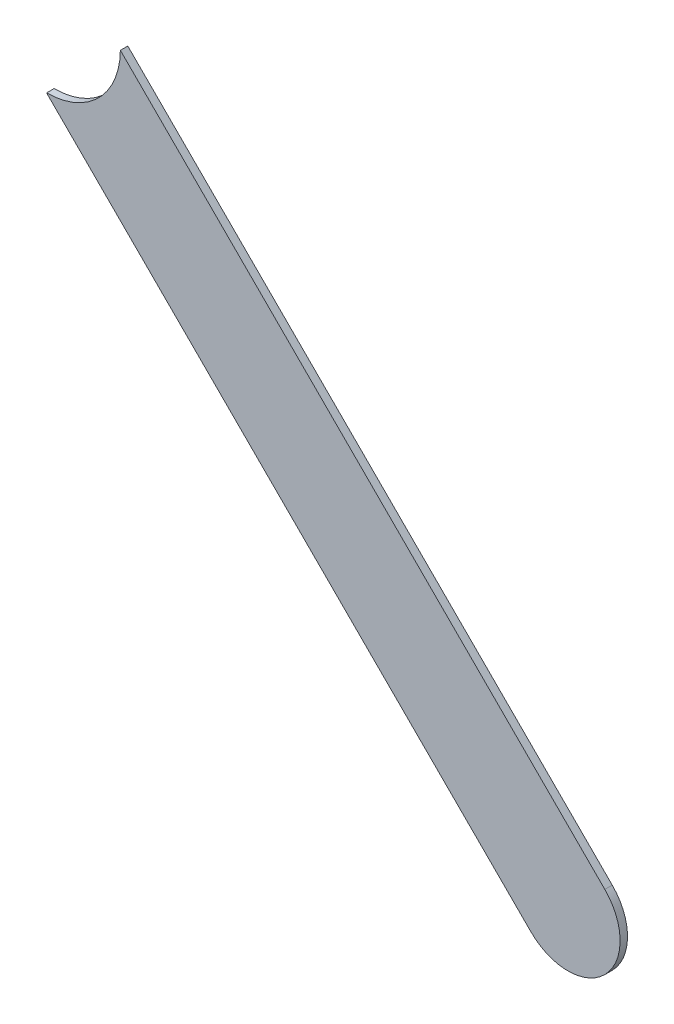
ISO-10303-21;
HEADER;
FILE_DESCRIPTION(('STEP AP214'),'2;1');
FILE_NAME('part.step','',(''),(''),'','','');
FILE_SCHEMA(('AUTOMOTIVE_DESIGN { 1 0 10303 214 1 1 1 1 }'));
ENDSEC;
DATA;
#1=APPLICATION_CONTEXT('core data for automotive mechanical design processes');
#2=APPLICATION_PROTOCOL_DEFINITION('international standard','automotive_design',2000,#1);
#3=PRODUCT_CONTEXT('',#1,'mechanical');
#4=PRODUCT('Part','Part','',(#3));
#5=PRODUCT_RELATED_PRODUCT_CATEGORY('part','',(#4));
#6=PRODUCT_DEFINITION_FORMATION('','',#4);
#7=PRODUCT_DEFINITION_CONTEXT('part definition',#1,'design');
#8=PRODUCT_DEFINITION('design','',#6,#7);
#9=PRODUCT_DEFINITION_SHAPE('','',#8);
#10=(LENGTH_UNIT() NAMED_UNIT(*) SI_UNIT(.MILLI.,.METRE.));
#11=(NAMED_UNIT(*) PLANE_ANGLE_UNIT() SI_UNIT($,.RADIAN.));
#12=(NAMED_UNIT(*) SI_UNIT($,.STERADIAN.) SOLID_ANGLE_UNIT());
#13=UNCERTAINTY_MEASURE_WITH_UNIT(LENGTH_MEASURE(1.E-05),#10,'distance_accuracy_value','');
#14=(GEOMETRIC_REPRESENTATION_CONTEXT(3) GLOBAL_UNCERTAINTY_ASSIGNED_CONTEXT((#13)) GLOBAL_UNIT_ASSIGNED_CONTEXT((#10,
#11,#12)) REPRESENTATION_CONTEXT('',''));
#15=CARTESIAN_POINT('',(0.,0.,0.));
#16=DIRECTION('',(0.,0.,1.));
#17=DIRECTION('',(1.,0.,0.));
#18=AXIS2_PLACEMENT_3D('',#15,#16,#17);
#19=CARTESIAN_POINT('',(62.4020435660036,104.144405153996,0.));
#20=DIRECTION('',(0.70710678118655,0.707106781186546,0.));
#21=DIRECTION('',(0.707106781186546,-0.70710678118655,0.));
#22=AXIS2_PLACEMENT_3D('',#19,#20,#21);
#23=PLANE('',#22);
#24=DIRECTION('',(0.707106781186546,-0.70710678118655,0.));
#25=VECTOR('',#24,1.);
#26=CARTESIAN_POINT('',(62.22322328,104.32322544,0.03556));
#27=LINE('',#26,#25);
#28=CARTESIAN_POINT('',(62.4020435660036,104.144405153996,0.03556));
#29=VERTEX_POINT('',#28);
#30=CARTESIAN_POINT('',(64.72322336,101.82322536,0.03556));
#31=VERTEX_POINT('',#30);
#32=EDGE_CURVE('E11',#29,#31,#27,.T.);
#33=ORIENTED_EDGE('',*,*,#32,.F.);
#34=DIRECTION('',(0.,0.,1.));
#35=VECTOR('',#34,1.);
#36=CARTESIAN_POINT('',(62.4020435660036,104.144405153996,0.));
#37=LINE('',#36,#35);
#38=CARTESIAN_POINT('',(62.4020435660036,104.144405153996,0.));
#39=VERTEX_POINT('',#38);
#40=EDGE_CURVE('E24',#39,#29,#37,.T.);
#41=ORIENTED_EDGE('',*,*,#40,.F.);
#42=DIRECTION('',(0.707106781186546,-0.70710678118655,0.));
#43=VECTOR('',#42,1.);
#44=CARTESIAN_POINT('',(62.22322328,104.32322544,0.));
#45=LINE('',#44,#43);
#46=CARTESIAN_POINT('',(64.72322336,101.82322536,0.));
#47=VERTEX_POINT('',#46);
#48=EDGE_CURVE('E75',#39,#47,#45,.T.);
#49=ORIENTED_EDGE('',*,*,#48,.T.);
#50=DIRECTION('',(0.,0.,1.));
#51=VECTOR('',#50,1.);
#52=CARTESIAN_POINT('',(64.72322336,101.82322536,0.));
#53=LINE('',#52,#51);
#54=EDGE_CURVE('E37',#47,#31,#53,.T.);
#55=ORIENTED_EDGE('',*,*,#54,.T.);
#56=EDGE_LOOP('',(#33,#41,#49,#55));
#57=FACE_BOUND('',#56,.T.);
#58=ADVANCED_FACE('F17',(#57),#23,.F.);
#59=CARTESIAN_POINT('',(64.89999974,102.00000174,0.));
#60=DIRECTION('',(0.,0.,-1.));
#61=DIRECTION('',(-0.707106781186576,-0.707106781186519,0.));
#62=AXIS2_PLACEMENT_3D('',#59,#60,#61);
#63=CYLINDRICAL_SURFACE('',#62,0.249999554103216);
#64=CARTESIAN_POINT('',(64.89999974,102.00000174,0.03556));
#65=DIRECTION('',(0.,0.,1.));
#66=DIRECTION('',(-0.707106781186576,-0.707106781186519,0.));
#67=AXIS2_PLACEMENT_3D('',#64,#65,#66);
#68=CIRCLE('',#67,0.249999554103216);
#69=CARTESIAN_POINT('',(65.07677612,102.17677812,0.03556));
#70=VERTEX_POINT('',#69);
#71=EDGE_CURVE('E83',#31,#70,#68,.T.);
#72=ORIENTED_EDGE('',*,*,#71,.F.);
#73=ORIENTED_EDGE('',*,*,#54,.F.);
#74=CARTESIAN_POINT('',(64.89999974,102.00000174,0.));
#75=DIRECTION('',(0.,0.,1.));
#76=DIRECTION('',(-0.707106781186576,-0.707106781186519,0.));
#77=AXIS2_PLACEMENT_3D('',#74,#75,#76);
#78=CIRCLE('',#77,0.249999554103216);
#79=CARTESIAN_POINT('',(65.07677612,102.17677812,0.));
#80=VERTEX_POINT('',#79);
#81=EDGE_CURVE('E81',#47,#80,#78,.T.);
#82=ORIENTED_EDGE('',*,*,#81,.T.);
#83=DIRECTION('',(0.,0.,1.));
#84=VECTOR('',#83,1.);
#85=CARTESIAN_POINT('',(65.07677612,102.17677812,0.));
#86=LINE('',#85,#84);
#87=EDGE_CURVE('E67',#80,#70,#86,.T.);
#88=ORIENTED_EDGE('',*,*,#87,.T.);
#89=EDGE_LOOP('',(#72,#73,#82,#88));
#90=FACE_BOUND('',#89,.T.);
#91=ADVANCED_FACE('F89',(#90),#63,.T.);
#92=CARTESIAN_POINT('',(65.07677612,102.17677812,0.));
#93=DIRECTION('',(-0.707106781186551,-0.707106781186544,0.));
#94=DIRECTION('',(-0.707106781186544,0.707106781186551,0.));
#95=AXIS2_PLACEMENT_3D('',#92,#93,#94);
#96=PLANE('',#95);
#97=DIRECTION('',(-0.707106781186544,0.707106781186551,0.));
#98=VECTOR('',#97,1.);
#99=CARTESIAN_POINT('',(65.07677612,102.17677812,0.03556));
#100=LINE('',#99,#98);
#101=CARTESIAN_POINT('',(62.7555938150002,104.497960425,0.03556));
#102=VERTEX_POINT('',#101);
#103=EDGE_CURVE('E71',#70,#102,#100,.T.);
#104=ORIENTED_EDGE('',*,*,#103,.F.);
#105=ORIENTED_EDGE('',*,*,#87,.F.);
#106=DIRECTION('',(-0.707106781186544,0.707106781186551,0.));
#107=VECTOR('',#106,1.);
#108=CARTESIAN_POINT('',(65.07677612,102.17677812,0.));
#109=LINE('',#108,#107);
#110=CARTESIAN_POINT('',(62.7555938150002,104.497960425,0.));
#111=VERTEX_POINT('',#110);
#112=EDGE_CURVE('E63',#80,#111,#109,.T.);
#113=ORIENTED_EDGE('',*,*,#112,.T.);
#114=DIRECTION('',(0.,0.,1.));
#115=VECTOR('',#114,1.);
#116=CARTESIAN_POINT('',(62.7555938150002,104.497960425,0.));
#117=LINE('',#116,#115);
#118=EDGE_CURVE('E53',#111,#102,#117,.T.);
#119=ORIENTED_EDGE('',*,*,#118,.T.);
#120=EDGE_LOOP('',(#104,#105,#113,#119));
#121=FACE_BOUND('',#120,.T.);
#122=ADVANCED_FACE('F66',(#121),#96,.F.);
#123=CARTESIAN_POINT('',(62.39999966,104.49999928,0.));
#124=DIRECTION('',(0.,0.,-1.));
#125=DIRECTION('',(1.,0.,0.));
#126=AXIS2_PLACEMENT_3D('',#123,#124,#125);
#127=CYLINDRICAL_SURFACE('',#126,0.3556);
#128=ORIENTED_EDGE('',*,*,#40,.T.);
#129=CARTESIAN_POINT('',(62.39999966,104.49999928,0.03556));
#130=DIRECTION('',(0.,0.,1.));
#131=DIRECTION('',(1.,0.,0.));
#132=AXIS2_PLACEMENT_3D('',#129,#130,#131);
#133=CIRCLE('',#132,0.3556);
#134=EDGE_CURVE('E59',#29,#102,#133,.T.);
#135=ORIENTED_EDGE('',*,*,#134,.T.);
#136=ORIENTED_EDGE('',*,*,#118,.F.);
#137=CARTESIAN_POINT('',(62.39999966,104.49999928,0.));
#138=DIRECTION('',(0.,0.,1.));
#139=DIRECTION('',(1.,0.,0.));
#140=AXIS2_PLACEMENT_3D('',#137,#138,#139);
#141=CIRCLE('',#140,0.3556);
#142=EDGE_CURVE('E57',#39,#111,#141,.T.);
#143=ORIENTED_EDGE('',*,*,#142,.F.);
#144=EDGE_LOOP('',(#128,#135,#136,#143));
#145=FACE_BOUND('',#144,.T.);
#146=ADVANCED_FACE('F55',(#145),#127,.F.);
#147=CARTESIAN_POINT('',(62.22322328,104.32322544,0.));
#148=DIRECTION('',(0.,0.,-1.));
#149=DIRECTION('',(-1.,0.,0.));
#150=AXIS2_PLACEMENT_3D('',#147,#148,#149);
#151=PLANE('',#150);
#152=ORIENTED_EDGE('',*,*,#48,.F.);
#153=ORIENTED_EDGE('',*,*,#142,.T.);
#154=ORIENTED_EDGE('',*,*,#112,.F.);
#155=ORIENTED_EDGE('',*,*,#81,.F.);
#156=EDGE_LOOP('',(#152,#153,#154,#155));
#157=FACE_BOUND('',#156,.T.);
#158=ADVANCED_FACE('F74',(#157),#151,.T.);
#159=CARTESIAN_POINT('',(62.22322328,104.32322544,0.03556));
#160=DIRECTION('',(0.,0.,-1.));
#161=DIRECTION('',(-1.,0.,0.));
#162=AXIS2_PLACEMENT_3D('',#159,#160,#161);
#163=PLANE('',#162);
#164=ORIENTED_EDGE('',*,*,#134,.F.);
#165=ORIENTED_EDGE('',*,*,#32,.T.);
#166=ORIENTED_EDGE('',*,*,#71,.T.);
#167=ORIENTED_EDGE('',*,*,#103,.T.);
#168=EDGE_LOOP('',(#164,#165,#166,#167));
#169=FACE_BOUND('',#168,.T.);
#170=ADVANCED_FACE('F91',(#169),#163,.F.);
#171=CLOSED_SHELL('',(#58,#91,#122,#146,#158,#170));
#172=MANIFOLD_SOLID_BREP('B1',#171);
#173=ADVANCED_BREP_SHAPE_REPRESENTATION('',(#18,#172),#14);
#174=SHAPE_DEFINITION_REPRESENTATION(#9,#173);
ENDSEC;
END-ISO-10303-21;
